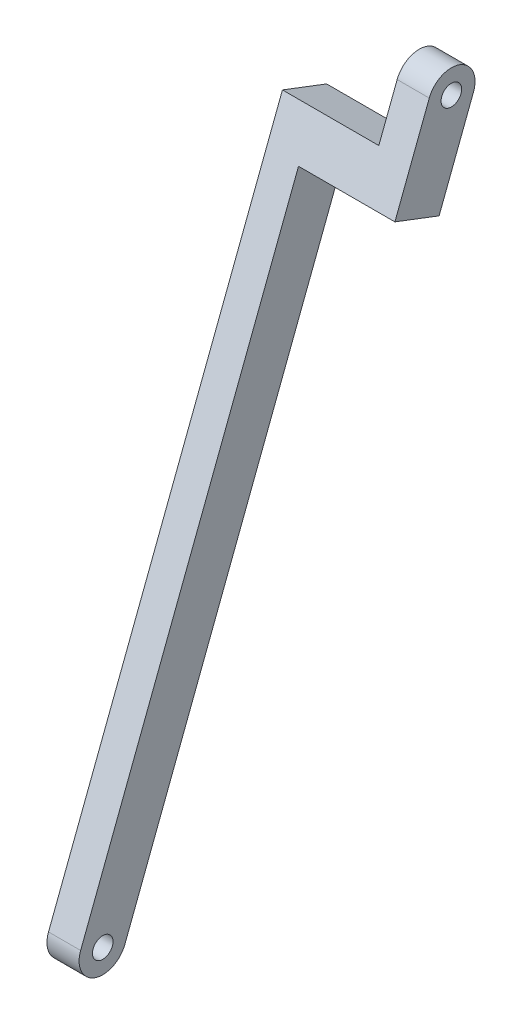
ISO-10303-21;
HEADER;
FILE_DESCRIPTION(('STEP AP214'),'2;1');
FILE_NAME('part.step','',(''),(''),'','','');
FILE_SCHEMA(('AUTOMOTIVE_DESIGN { 1 0 10303 214 1 1 1 1 }'));
ENDSEC;
DATA;
#1=APPLICATION_CONTEXT('core data for automotive mechanical design processes');
#2=APPLICATION_PROTOCOL_DEFINITION('international standard','automotive_design',2000,#1);
#3=PRODUCT_CONTEXT('',#1,'mechanical');
#4=PRODUCT('Part','Part','',(#3));
#5=PRODUCT_RELATED_PRODUCT_CATEGORY('part','',(#4));
#6=PRODUCT_DEFINITION_FORMATION('','',#4);
#7=PRODUCT_DEFINITION_CONTEXT('part definition',#1,'design');
#8=PRODUCT_DEFINITION('design','',#6,#7);
#9=PRODUCT_DEFINITION_SHAPE('','',#8);
#10=(LENGTH_UNIT() NAMED_UNIT(*) SI_UNIT(.MILLI.,.METRE.));
#11=(NAMED_UNIT(*) PLANE_ANGLE_UNIT() SI_UNIT($,.RADIAN.));
#12=(NAMED_UNIT(*) SI_UNIT($,.STERADIAN.) SOLID_ANGLE_UNIT());
#13=UNCERTAINTY_MEASURE_WITH_UNIT(LENGTH_MEASURE(1.E-05),#10,'distance_accuracy_value','');
#14=(GEOMETRIC_REPRESENTATION_CONTEXT(3) GLOBAL_UNCERTAINTY_ASSIGNED_CONTEXT((#13)) GLOBAL_UNIT_ASSIGNED_CONTEXT((#10,
#11,#12)) REPRESENTATION_CONTEXT('',''));
#15=CARTESIAN_POINT('',(0.,0.,0.));
#16=DIRECTION('',(0.,0.,1.));
#17=DIRECTION('',(1.,0.,0.));
#18=AXIS2_PLACEMENT_3D('',#15,#16,#17);
#19=CARTESIAN_POINT('',(-5.88721461174121,-12.4845580370763,4.76976216331783));
#20=DIRECTION('',(0.,-0.934145286734475,0.356892957722293));
#21=DIRECTION('',(0.,-0.356892957722293,-0.934145286734475));
#22=AXIS2_PLACEMENT_3D('',#19,#20,#21);
#23=PLANE('',#22);
#24=DIRECTION('',(-1.,0.,0.));
#25=VECTOR('',#24,1.);
#26=CARTESIAN_POINT('',(-5.88721461174121,-12.6959272911553,4.21651618805785));
#27=LINE('',#26,#25);
#28=CARTESIAN_POINT('',(-19.,-12.6959272911553,4.21651618805785));
#29=VERTEX_POINT('',#28);
#30=CARTESIAN_POINT('',(-34.,-12.6959272911553,4.21651618805785));
#31=VERTEX_POINT('',#30);
#32=EDGE_CURVE('E156',#29,#31,#27,.T.);
#33=ORIENTED_EDGE('',*,*,#32,.T.);
#34=DIRECTION('',(0.,-0.356892957722293,-0.934145286734475));
#35=VECTOR('',#34,1.);
#36=CARTESIAN_POINT('',(-34.,-12.4845580370763,4.76976216331783));
#37=LINE('',#36,#35);
#38=CARTESIAN_POINT('',(-34.,-15.3237061330711,-2.66153272448553));
#39=VERTEX_POINT('',#38);
#40=EDGE_CURVE('E11',#31,#39,#37,.T.);
#41=ORIENTED_EDGE('',*,*,#40,.T.);
#42=DIRECTION('',(-1.,0.,0.));
#43=VECTOR('',#42,1.);
#44=CARTESIAN_POINT('',(-5.88721461174121,-15.3237061330711,-2.66153272448553));
#45=LINE('',#44,#43);
#46=CARTESIAN_POINT('',(-19.,-15.3237061330711,-2.66153272448553));
#47=VERTEX_POINT('',#46);
#48=EDGE_CURVE('E147',#47,#39,#45,.T.);
#49=ORIENTED_EDGE('',*,*,#48,.F.);
#50=DIRECTION('',(0.,0.356892957722293,0.934145286734475));
#51=VECTOR('',#50,1.);
#52=CARTESIAN_POINT('',(-19.,-12.4845580370763,4.76976216331783));
#53=LINE('',#52,#51);
#54=EDGE_CURVE('E123',#47,#29,#53,.T.);
#55=ORIENTED_EDGE('',*,*,#54,.T.);
#56=EDGE_LOOP('',(#33,#41,#49,#55));
#57=FACE_BOUND('',#56,.T.);
#58=ADVANCED_FACE('F50',(#57),#23,.T.);
#59=CARTESIAN_POINT('',(-39.,0.,-4.57499999999999));
#60=DIRECTION('',(1.,0.,0.));
#61=DIRECTION('',(0.,0.,-1.));
#62=AXIS2_PLACEMENT_3D('',#59,#60,#61);
#63=CYLINDRICAL_SURFACE('',#62,3.68146636835648);
#64=DIRECTION('',(-1.,0.,0.));
#65=VECTOR('',#64,1.);
#66=CARTESIAN_POINT('',(-4.97506662585495,1.31388942095789,-1.1359755437283));
#67=LINE('',#66,#65);
#68=CARTESIAN_POINT('',(-19.,1.31388942095789,-1.1359755437283));
#69=VERTEX_POINT('',#68);
#70=CARTESIAN_POINT('',(-24.,1.31388942095789,-1.1359755437283));
#71=VERTEX_POINT('',#70);
#72=EDGE_CURVE('E170',#69,#71,#67,.T.);
#73=ORIENTED_EDGE('',*,*,#72,.F.);
#74=CARTESIAN_POINT('',(-19.,0.,-4.57499999999999));
#75=DIRECTION('',(1.,0.,0.));
#76=DIRECTION('',(0.,0.,-1.));
#77=AXIS2_PLACEMENT_3D('',#74,#75,#76);
#78=CIRCLE('',#77,3.68146636835648);
#79=CARTESIAN_POINT('',(-19.,-1.31388942095789,-8.01402445627168));
#80=VERTEX_POINT('',#79);
#81=EDGE_CURVE('E54',#80,#69,#78,.T.);
#82=ORIENTED_EDGE('',*,*,#81,.F.);
#83=DIRECTION('',(-1.,0.,0.));
#84=VECTOR('',#83,1.);
#85=CARTESIAN_POINT('',(-4.97506662585495,-1.31388942095789,-8.01402445627168));
#86=LINE('',#85,#84);
#87=CARTESIAN_POINT('',(-24.,-1.31388942095789,-8.01402445627169));
#88=VERTEX_POINT('',#87);
#89=EDGE_CURVE('E166',#80,#88,#86,.T.);
#90=ORIENTED_EDGE('',*,*,#89,.T.);
#91=CARTESIAN_POINT('',(-24.,0.,-4.57499999999999));
#92=DIRECTION('',(1.,0.,0.));
#93=DIRECTION('',(0.,0.,-1.));
#94=AXIS2_PLACEMENT_3D('',#91,#92,#93);
#95=CIRCLE('',#94,3.68146636835648);
#96=EDGE_CURVE('E173',#88,#71,#95,.T.);
#97=ORIENTED_EDGE('',*,*,#96,.T.);
#98=EDGE_LOOP('',(#73,#82,#90,#97));
#99=FACE_BOUND('',#98,.T.);
#100=ADVANCED_FACE('F186',(#99),#63,.T.);
#101=CARTESIAN_POINT('',(-19.,0.,38.66));
#102=DIRECTION('',(1.,0.,0.));
#103=DIRECTION('',(0.,0.,-1.));
#104=AXIS2_PLACEMENT_3D('',#101,#102,#103);
#105=PLANE('',#104);
#106=ORIENTED_EDGE('',*,*,#81,.T.);
#107=DIRECTION('',(0.,-0.934145286734475,0.356892957722293));
#108=VECTOR('',#107,1.);
#109=CARTESIAN_POINT('',(-19.,-13.1002217954837,4.37097809402651));
#110=LINE('',#109,#108);
#111=EDGE_CURVE('E167',#69,#29,#110,.T.);
#112=ORIENTED_EDGE('',*,*,#111,.T.);
#113=ORIENTED_EDGE('',*,*,#54,.F.);
#114=DIRECTION('',(0.,0.934145286734475,-0.356892957722293));
#115=VECTOR('',#114,1.);
#116=CARTESIAN_POINT('',(-19.,-15.7280006373995,-2.50707081851687));
#117=LINE('',#116,#115);
#118=EDGE_CURVE('E175',#47,#80,#117,.T.);
#119=ORIENTED_EDGE('',*,*,#118,.T.);
#120=EDGE_LOOP('',(#106,#112,#113,#119));
#121=FACE_BOUND('',#120,.T.);
#122=CARTESIAN_POINT('',(-19.,0.,-4.57499999999999));
#123=DIRECTION('',(1.,0.,0.));
#124=DIRECTION('',(0.,0.,-1.));
#125=AXIS2_PLACEMENT_3D('',#122,#123,#124);
#126=CIRCLE('',#125,1.6);
#127=CARTESIAN_POINT('',(-19.,0.,-2.97499999999999));
#128=VERTEX_POINT('',#127);
#129=EDGE_CURVE('E142',#128,#128,#126,.T.);
#130=ORIENTED_EDGE('',*,*,#129,.F.);
#131=EDGE_LOOP('',(#130));
#132=FACE_BOUND('',#131,.T.);
#133=ADVANCED_FACE('F181',(#121,#132),#105,.T.);
#134=CARTESIAN_POINT('',(-24.,0.,38.66));
#135=DIRECTION('',(1.,0.,0.));
#136=DIRECTION('',(0.,0.,-1.));
#137=AXIS2_PLACEMENT_3D('',#134,#135,#136);
#138=PLANE('',#137);
#139=CARTESIAN_POINT('',(-24.,0.,-4.57499999999999));
#140=DIRECTION('',(-1.,0.,0.));
#141=DIRECTION('',(0.,0.,1.));
#142=AXIS2_PLACEMENT_3D('',#139,#140,#141);
#143=CIRCLE('',#142,1.6);
#144=CARTESIAN_POINT('',(-24.,0.,-2.97499999999999));
#145=VERTEX_POINT('',#144);
#146=EDGE_CURVE('E138',#145,#145,#143,.T.);
#147=ORIENTED_EDGE('',*,*,#146,.F.);
#148=EDGE_LOOP('',(#147));
#149=FACE_BOUND('',#148,.T.);
#150=ORIENTED_EDGE('',*,*,#96,.F.);
#151=DIRECTION('',(0.,0.934145286734475,-0.356892957722293));
#152=VECTOR('',#151,1.);
#153=CARTESIAN_POINT('',(-24.,-15.7280006373995,-2.50707081851687));
#154=LINE('',#153,#152);
#155=CARTESIAN_POINT('',(-24.,-8.78468912592975,-5.15978342854158));
#156=VERTEX_POINT('',#155);
#157=EDGE_CURVE('E68',#156,#88,#154,.T.);
#158=ORIENTED_EDGE('',*,*,#157,.F.);
#159=DIRECTION('',(0.,-0.356892957722293,-0.934145286734475));
#160=VECTOR('',#159,1.);
#161=CARTESIAN_POINT('',(-24.,6.94331151146977,36.0072873899753));
#162=LINE('',#161,#160);
#163=CARTESIAN_POINT('',(-24.,-6.15691028401397,1.7182654840018));
#164=VERTEX_POINT('',#163);
#165=EDGE_CURVE('E162',#164,#156,#162,.T.);
#166=ORIENTED_EDGE('',*,*,#165,.F.);
#167=DIRECTION('',(0.,-0.934145286734475,0.356892957722293));
#168=VECTOR('',#167,1.);
#169=CARTESIAN_POINT('',(-24.,-13.1002217954837,4.37097809402651));
#170=LINE('',#169,#168);
#171=EDGE_CURVE('E163',#71,#164,#170,.T.);
#172=ORIENTED_EDGE('',*,*,#171,.F.);
#173=EDGE_LOOP('',(#150,#158,#166,#172));
#174=FACE_BOUND('',#173,.T.);
#175=ADVANCED_FACE('F47',(#149,#174),#138,.F.);
#176=CARTESIAN_POINT('',(-4.97506662585495,-15.7280006373995,-2.50707081851687));
#177=DIRECTION('',(0.,0.356892957722293,0.934145286734475));
#178=DIRECTION('',(0.,-0.934145286734475,0.356892957722293));
#179=AXIS2_PLACEMENT_3D('',#176,#177,#178);
#180=PLANE('',#179);
#181=ORIENTED_EDGE('',*,*,#48,.T.);
#182=DIRECTION('',(0.,0.934145286734475,-0.356892957722293));
#183=VECTOR('',#182,1.);
#184=CARTESIAN_POINT('',(-34.,-2.83914809599479,-7.43129488780335));
#185=LINE('',#184,#183);
#186=CARTESIAN_POINT('',(-34.,-104.06987096175,31.2442008931805));
#187=VERTEX_POINT('',#186);
#188=EDGE_CURVE('E65',#187,#39,#185,.T.);
#189=ORIENTED_EDGE('',*,*,#188,.F.);
#190=DIRECTION('',(1.,0.,0.));
#191=VECTOR('',#190,1.);
#192=CARTESIAN_POINT('',(-39.,-104.06987096175,31.2442008931805));
#193=LINE('',#192,#191);
#194=CARTESIAN_POINT('',(-39.,-104.06987096175,31.2442008931805));
#195=VERTEX_POINT('',#194);
#196=EDGE_CURVE('E131',#195,#187,#193,.T.);
#197=ORIENTED_EDGE('',*,*,#196,.F.);
#198=DIRECTION('',(0.,-0.934145286734475,0.356892957722293));
#199=VECTOR('',#198,1.);
#200=CARTESIAN_POINT('',(-39.,-2.83914809599479,-7.43129488780335));
#201=LINE('',#200,#199);
#202=CARTESIAN_POINT('',(-39.,-8.78468912592975,-5.15978342854158));
#203=VERTEX_POINT('',#202);
#204=EDGE_CURVE('E124',#203,#195,#201,.T.);
#205=ORIENTED_EDGE('',*,*,#204,.F.);
#206=DIRECTION('',(-1.,0.,0.));
#207=VECTOR('',#206,1.);
#208=CARTESIAN_POINT('',(-5.88721461174121,-8.78468912592975,-5.15978342854158));
#209=LINE('',#208,#207);
#210=EDGE_CURVE('E151',#156,#203,#209,.T.);
#211=ORIENTED_EDGE('',*,*,#210,.F.);
#212=ORIENTED_EDGE('',*,*,#157,.T.);
#213=ORIENTED_EDGE('',*,*,#89,.F.);
#214=ORIENTED_EDGE('',*,*,#118,.F.);
#215=EDGE_LOOP('',(#181,#189,#197,#205,#211,#212,#213,#214));
#216=FACE_BOUND('',#215,.T.);
#217=ADVANCED_FACE('F198',(#216),#180,.F.);
#218=CARTESIAN_POINT('',(-4.97506662585495,-13.1002217954837,4.37097809402651));
#219=DIRECTION('',(0.,-0.356892957722293,-0.934145286734475));
#220=DIRECTION('',(0.,0.934145286734475,-0.356892957722293));
#221=AXIS2_PLACEMENT_3D('',#218,#219,#220);
#222=PLANE('',#221);
#223=DIRECTION('',(0.,0.934145286734475,-0.356892957722293));
#224=VECTOR('',#223,1.);
#225=CARTESIAN_POINT('',(-39.,-0.211369254079004,-0.553245975259973));
#226=LINE('',#225,#224);
#227=CARTESIAN_POINT('',(-39.,-101.442092119834,38.1222498057239));
#228=VERTEX_POINT('',#227);
#229=CARTESIAN_POINT('',(-39.,-6.15691028401397,1.7182654840018));
#230=VERTEX_POINT('',#229);
#231=EDGE_CURVE('E115',#228,#230,#226,.T.);
#232=ORIENTED_EDGE('',*,*,#231,.F.);
#233=DIRECTION('',(1.,0.,0.));
#234=VECTOR('',#233,1.);
#235=CARTESIAN_POINT('',(-39.,-101.442092119834,38.1222498057239));
#236=LINE('',#235,#234);
#237=CARTESIAN_POINT('',(-34.,-101.442092119834,38.1222498057239));
#238=VERTEX_POINT('',#237);
#239=EDGE_CURVE('E120',#228,#238,#236,.T.);
#240=ORIENTED_EDGE('',*,*,#239,.T.);
#241=DIRECTION('',(0.,0.934145286734475,-0.356892957722293));
#242=VECTOR('',#241,1.);
#243=CARTESIAN_POINT('',(-34.,-0.211369254079004,-0.553245975259973));
#244=LINE('',#243,#242);
#245=EDGE_CURVE('E200',#238,#31,#244,.T.);
#246=ORIENTED_EDGE('',*,*,#245,.T.);
#247=ORIENTED_EDGE('',*,*,#32,.F.);
#248=ORIENTED_EDGE('',*,*,#111,.F.);
#249=ORIENTED_EDGE('',*,*,#72,.T.);
#250=ORIENTED_EDGE('',*,*,#171,.T.);
#251=DIRECTION('',(-1.,0.,0.));
#252=VECTOR('',#251,1.);
#253=CARTESIAN_POINT('',(-5.88721461174121,-6.15691028401397,1.7182654840018));
#254=LINE('',#253,#252);
#255=EDGE_CURVE('E118',#164,#230,#254,.T.);
#256=ORIENTED_EDGE('',*,*,#255,.T.);
#257=EDGE_LOOP('',(#232,#240,#246,#247,#248,#249,#250,#256));
#258=FACE_BOUND('',#257,.T.);
#259=ADVANCED_FACE('F111',(#258),#222,.F.);
#260=CARTESIAN_POINT('',(-5.88721461174121,-5.94554102993496,2.27151145926177));
#261=DIRECTION('',(0.,-0.934145286734475,0.356892957722293));
#262=DIRECTION('',(0.,-0.356892957722293,-0.934145286734475));
#263=AXIS2_PLACEMENT_3D('',#260,#261,#262);
#264=PLANE('',#263);
#265=ORIENTED_EDGE('',*,*,#210,.T.);
#266=DIRECTION('',(0.,0.356892957722293,0.934145286734475));
#267=VECTOR('',#266,1.);
#268=CARTESIAN_POINT('',(-39.,-5.94554102993496,2.27151145926177));
#269=LINE('',#268,#267);
#270=EDGE_CURVE('E149',#203,#230,#269,.T.);
#271=ORIENTED_EDGE('',*,*,#270,.T.);
#272=ORIENTED_EDGE('',*,*,#255,.F.);
#273=ORIENTED_EDGE('',*,*,#165,.T.);
#274=EDGE_LOOP('',(#265,#271,#272,#273));
#275=FACE_BOUND('',#274,.T.);
#276=ADVANCED_FACE('F194',(#275),#264,.F.);
#277=CARTESIAN_POINT('',(-39.,0.,0.));
#278=DIRECTION('',(-1.,0.,0.));
#279=DIRECTION('',(0.,0.,1.));
#280=AXIS2_PLACEMENT_3D('',#277,#278,#279);
#281=PLANE('',#280);
#282=ORIENTED_EDGE('',*,*,#204,.T.);
#283=CARTESIAN_POINT('',(-39.,-102.755981540792,34.6832253494522));
#284=DIRECTION('',(-1.,0.,0.));
#285=DIRECTION('',(0.,0.,1.));
#286=AXIS2_PLACEMENT_3D('',#283,#284,#285);
#287=CIRCLE('',#286,3.68146636835649);
#288=EDGE_CURVE('E126',#195,#228,#287,.T.);
#289=ORIENTED_EDGE('',*,*,#288,.T.);
#290=ORIENTED_EDGE('',*,*,#231,.T.);
#291=ORIENTED_EDGE('',*,*,#270,.F.);
#292=EDGE_LOOP('',(#282,#289,#290,#291));
#293=FACE_BOUND('',#292,.T.);
#294=CARTESIAN_POINT('',(-39.,-102.755981540792,34.6832253494522));
#295=DIRECTION('',(-1.,0.,0.));
#296=DIRECTION('',(0.,0.,1.));
#297=AXIS2_PLACEMENT_3D('',#294,#295,#296);
#298=CIRCLE('',#297,1.6);
#299=CARTESIAN_POINT('',(-39.,-102.755981540792,36.2832253494522));
#300=VERTEX_POINT('',#299);
#301=EDGE_CURVE('E133',#300,#300,#298,.T.);
#302=ORIENTED_EDGE('',*,*,#301,.F.);
#303=EDGE_LOOP('',(#302));
#304=FACE_BOUND('',#303,.T.);
#305=ADVANCED_FACE('F129',(#293,#304),#281,.T.);
#306=CARTESIAN_POINT('',(18.,0.,-4.57499999999999));
#307=DIRECTION('',(-1.,0.,0.));
#308=DIRECTION('',(0.,0.,1.));
#309=AXIS2_PLACEMENT_3D('',#306,#307,#308);
#310=CYLINDRICAL_SURFACE('',#309,1.6);
#311=CARTESIAN_POINT('',(-19.,0.,-2.97499999999999));
#312=CARTESIAN_POINT('',(-19.0520833333333,0.,-2.97499999999999));
#313=CARTESIAN_POINT('',(-19.1041666666667,0.,-2.97499999999999));
#314=CARTESIAN_POINT('',(-19.2083333333333,0.,-2.97499999999999));
#315=CARTESIAN_POINT('',(-19.2604166666667,0.,-2.97499999999999));
#316=CARTESIAN_POINT('',(-19.3645833333333,0.,-2.97499999999999));
#317=CARTESIAN_POINT('',(-19.4166666666667,0.,-2.97499999999999));
#318=CARTESIAN_POINT('',(-19.5208333333333,0.,-2.97499999999999));
#319=CARTESIAN_POINT('',(-19.5729166666667,0.,-2.97499999999999));
#320=CARTESIAN_POINT('',(-19.6770833333333,0.,-2.97499999999999));
#321=CARTESIAN_POINT('',(-19.7291666666667,0.,-2.97499999999999));
#322=CARTESIAN_POINT('',(-19.8333333333333,0.,-2.97499999999999));
#323=CARTESIAN_POINT('',(-19.8854166666667,0.,-2.97499999999999));
#324=CARTESIAN_POINT('',(-19.9895833333333,0.,-2.97499999999999));
#325=CARTESIAN_POINT('',(-20.0416666666667,0.,-2.97499999999999));
#326=CARTESIAN_POINT('',(-20.1458333333333,0.,-2.97499999999999));
#327=CARTESIAN_POINT('',(-20.1979166666667,0.,-2.97499999999999));
#328=CARTESIAN_POINT('',(-20.3020833333333,0.,-2.97499999999999));
#329=CARTESIAN_POINT('',(-20.3541666666667,0.,-2.97499999999999));
#330=CARTESIAN_POINT('',(-20.4583333333333,0.,-2.97499999999999));
#331=CARTESIAN_POINT('',(-20.5104166666667,0.,-2.97499999999999));
#332=CARTESIAN_POINT('',(-20.6145833333333,0.,-2.97499999999999));
#333=CARTESIAN_POINT('',(-20.6666666666667,0.,-2.97499999999999));
#334=CARTESIAN_POINT('',(-20.7708333333333,0.,-2.97499999999999));
#335=CARTESIAN_POINT('',(-20.8229166666667,0.,-2.97499999999999));
#336=CARTESIAN_POINT('',(-20.9270833333333,0.,-2.97499999999999));
#337=CARTESIAN_POINT('',(-20.9791666666667,0.,-2.97499999999999));
#338=CARTESIAN_POINT('',(-21.0833333333333,0.,-2.97499999999999));
#339=CARTESIAN_POINT('',(-21.1354166666667,0.,-2.97499999999999));
#340=CARTESIAN_POINT('',(-21.2395833333333,0.,-2.97499999999999));
#341=CARTESIAN_POINT('',(-21.2916666666667,0.,-2.97499999999999));
#342=CARTESIAN_POINT('',(-21.3958333333333,0.,-2.97499999999999));
#343=CARTESIAN_POINT('',(-21.4479166666667,0.,-2.97499999999999));
#344=CARTESIAN_POINT('',(-21.5520833333333,0.,-2.97499999999999));
#345=CARTESIAN_POINT('',(-21.6041666666667,0.,-2.97499999999999));
#346=CARTESIAN_POINT('',(-21.7083333333333,0.,-2.97499999999999));
#347=CARTESIAN_POINT('',(-21.7604166666667,0.,-2.97499999999999));
#348=CARTESIAN_POINT('',(-21.8645833333333,0.,-2.97499999999999));
#349=CARTESIAN_POINT('',(-21.9166666666667,0.,-2.97499999999999));
#350=CARTESIAN_POINT('',(-22.0208333333333,0.,-2.97499999999999));
#351=CARTESIAN_POINT('',(-22.0729166666667,0.,-2.97499999999999));
#352=CARTESIAN_POINT('',(-22.1770833333333,0.,-2.97499999999999));
#353=CARTESIAN_POINT('',(-22.2291666666667,0.,-2.97499999999999));
#354=CARTESIAN_POINT('',(-22.3333333333333,0.,-2.97499999999999));
#355=CARTESIAN_POINT('',(-22.3854166666667,0.,-2.97499999999999));
#356=CARTESIAN_POINT('',(-22.4895833333333,0.,-2.97499999999999));
#357=CARTESIAN_POINT('',(-22.5416666666667,0.,-2.97499999999999));
#358=CARTESIAN_POINT('',(-22.6458333333333,0.,-2.97499999999999));
#359=CARTESIAN_POINT('',(-22.6979166666667,0.,-2.97499999999999));
#360=CARTESIAN_POINT('',(-22.8020833333333,0.,-2.97499999999999));
#361=CARTESIAN_POINT('',(-22.8541666666667,0.,-2.97499999999999));
#362=CARTESIAN_POINT('',(-22.9583333333333,0.,-2.97499999999999));
#363=CARTESIAN_POINT('',(-23.0104166666667,0.,-2.97499999999999));
#364=CARTESIAN_POINT('',(-23.1145833333333,0.,-2.97499999999999));
#365=CARTESIAN_POINT('',(-23.1666666666667,0.,-2.97499999999999));
#366=CARTESIAN_POINT('',(-23.2708333333333,0.,-2.97499999999999));
#367=CARTESIAN_POINT('',(-23.3229166666667,0.,-2.97499999999999));
#368=CARTESIAN_POINT('',(-23.4270833333333,0.,-2.97499999999999));
#369=CARTESIAN_POINT('',(-23.4791666666667,0.,-2.97499999999999));
#370=CARTESIAN_POINT('',(-23.5833333333333,0.,-2.97499999999999));
#371=CARTESIAN_POINT('',(-23.6354166666667,0.,-2.97499999999999));
#372=CARTESIAN_POINT('',(-23.7395833333333,0.,-2.97499999999999));
#373=CARTESIAN_POINT('',(-23.7916666666667,0.,-2.97499999999999));
#374=CARTESIAN_POINT('',(-23.8958333333333,0.,-2.97499999999999));
#375=CARTESIAN_POINT('',(-23.9479166666667,0.,-2.97499999999999));
#376=CARTESIAN_POINT('',(-24.,0.,-2.97499999999999));
#377=B_SPLINE_CURVE_WITH_KNOTS('',3,(#311,#312,#313,#314,#315,#316,#317,#318,#319,#320,#321,
#322,#323,#324,#325,#326,#327,#328,#329,#330,#331,#332,#333,#334,#335,#336,#337,#338,#339,#340,
#341,#342,#343,#344,#345,#346,#347,#348,#349,#350,#351,#352,#353,#354,#355,#356,#357,#358,#359,
#360,#361,#362,#363,#364,#365,#366,#367,#368,#369,#370,#371,#372,#373,#374,#375,#376),
.UNSPECIFIED.,.F.,.F.,(4,2,2,2,2,2,2,2,2,2,2,2,2,2,2,2,2,2,2,2,2,2,2,2,2,2,2,2,2,2,2,2,4),(0.,
0.156249999999997,0.3125,0.468749999999997,0.625000000000001,0.781249999999997,
0.937500000000001,1.09375,1.25,1.40625,1.56249999999999,1.71875,1.87499999999999,2.03125,2.1875,
2.34375,2.5,2.65624999999999,2.8125,2.96874999999999,3.125,3.28124999999999,3.4375,
3.59374999999999,3.74999999999999,3.90624999999999,4.06249999999999,4.21874999999999,
4.37499999999999,4.53124999999999,4.68749999999999,4.84374999999999,4.99999999999999),.UNSPECIFIED.);
#378=EDGE_CURVE('BSEAM215',#128,#145,#377,.T.);
#379=ORIENTED_EDGE('',*,*,#129,.T.);
#380=ORIENTED_EDGE('',*,*,#146,.T.);
#381=ORIENTED_EDGE('',*,*,#378,.T.);
#382=ORIENTED_EDGE('',*,*,#378,.F.);
#383=EDGE_LOOP('',(#379,#381,#380,#382));
#384=FACE_BOUND('',#383,.T.);
#385=ADVANCED_FACE('F215',(#384),#310,.F.);
#386=CARTESIAN_POINT('',(-39.,-102.755981540792,34.6832253494522));
#387=DIRECTION('',(1.,0.,0.));
#388=DIRECTION('',(0.,0.,-1.));
#389=AXIS2_PLACEMENT_3D('',#386,#387,#388);
#390=CYLINDRICAL_SURFACE('',#389,3.68146636835649);
#391=CARTESIAN_POINT('',(-34.,-102.755981540792,34.6832253494522));
#392=DIRECTION('',(-1.,0.,0.));
#393=DIRECTION('',(0.,0.,1.));
#394=AXIS2_PLACEMENT_3D('',#391,#392,#393);
#395=CIRCLE('',#394,3.68146636835649);
#396=EDGE_CURVE('E137',#187,#238,#395,.T.);
#397=ORIENTED_EDGE('',*,*,#396,.T.);
#398=ORIENTED_EDGE('',*,*,#239,.F.);
#399=ORIENTED_EDGE('',*,*,#288,.F.);
#400=ORIENTED_EDGE('',*,*,#196,.T.);
#401=EDGE_LOOP('',(#397,#398,#399,#400));
#402=FACE_BOUND('',#401,.T.);
#403=ADVANCED_FACE('F140',(#402),#390,.T.);
#404=CARTESIAN_POINT('',(-39.,-102.755981540792,34.6832253494522));
#405=DIRECTION('',(1.,0.,0.));
#406=DIRECTION('',(0.,0.,-1.));
#407=AXIS2_PLACEMENT_3D('',#404,#405,#406);
#408=CYLINDRICAL_SURFACE('',#407,1.6);
#409=ORIENTED_EDGE('',*,*,#301,.T.);
#410=EDGE_LOOP('',(#409));
#411=FACE_BOUND('',#410,.T.);
#412=CARTESIAN_POINT('',(-34.,-102.755981540792,34.6832253494522));
#413=DIRECTION('',(-1.,0.,0.));
#414=DIRECTION('',(0.,0.,1.));
#415=AXIS2_PLACEMENT_3D('',#412,#413,#414);
#416=CIRCLE('',#415,1.6);
#417=CARTESIAN_POINT('',(-34.,-102.755981540792,36.2832253494522));
#418=VERTEX_POINT('',#417);
#419=EDGE_CURVE('E199',#418,#418,#416,.T.);
#420=ORIENTED_EDGE('',*,*,#419,.F.);
#421=EDGE_LOOP('',(#420));
#422=FACE_BOUND('',#421,.T.);
#423=ADVANCED_FACE('F207',(#411,#422),#408,.F.);
#424=CARTESIAN_POINT('',(-34.,0.,0.));
#425=DIRECTION('',(-1.,0.,0.));
#426=DIRECTION('',(0.,0.,1.));
#427=AXIS2_PLACEMENT_3D('',#424,#425,#426);
#428=PLANE('',#427);
#429=ORIENTED_EDGE('',*,*,#40,.F.);
#430=ORIENTED_EDGE('',*,*,#245,.F.);
#431=ORIENTED_EDGE('',*,*,#396,.F.);
#432=ORIENTED_EDGE('',*,*,#188,.T.);
#433=EDGE_LOOP('',(#429,#430,#431,#432));
#434=FACE_BOUND('',#433,.T.);
#435=ORIENTED_EDGE('',*,*,#419,.T.);
#436=EDGE_LOOP('',(#435));
#437=FACE_BOUND('',#436,.T.);
#438=ADVANCED_FACE('F197',(#434,#437),#428,.F.);
#439=CLOSED_SHELL('',(#58,#100,#133,#175,#217,#259,#276,#305,#385,#403,#423,#438));
#440=MANIFOLD_SOLID_BREP('B2',#439);
#441=ADVANCED_BREP_SHAPE_REPRESENTATION('',(#18,#440),#14);
#442=SHAPE_DEFINITION_REPRESENTATION(#9,#441);
ENDSEC;
END-ISO-10303-21;
